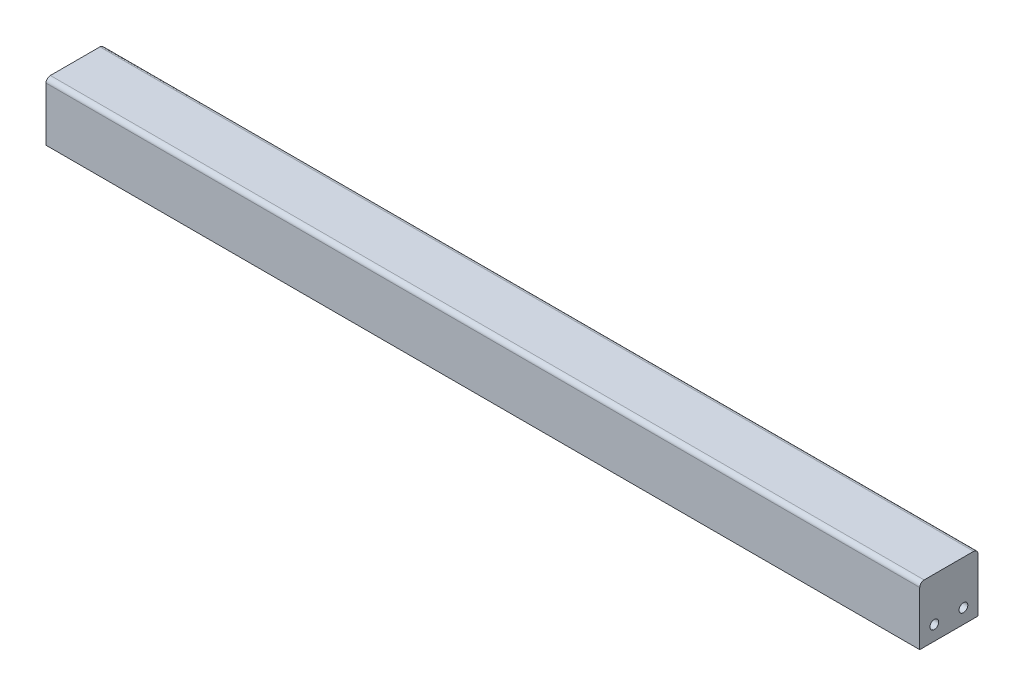
ISO-10303-21;
HEADER;
FILE_DESCRIPTION(('STEP AP214'),'2;1');
FILE_NAME('part.step','',(''),(''),'','','');
FILE_SCHEMA(('AUTOMOTIVE_DESIGN { 1 0 10303 214 1 1 1 1 }'));
ENDSEC;
DATA;
#1=APPLICATION_CONTEXT('core data for automotive mechanical design processes');
#2=APPLICATION_PROTOCOL_DEFINITION('international standard','automotive_design',2000,#1);
#3=PRODUCT_CONTEXT('',#1,'mechanical');
#4=PRODUCT('Part','Part','',(#3));
#5=PRODUCT_RELATED_PRODUCT_CATEGORY('part','',(#4));
#6=PRODUCT_DEFINITION_FORMATION('','',#4);
#7=PRODUCT_DEFINITION_CONTEXT('part definition',#1,'design');
#8=PRODUCT_DEFINITION('design','',#6,#7);
#9=PRODUCT_DEFINITION_SHAPE('','',#8);
#10=(LENGTH_UNIT() NAMED_UNIT(*) SI_UNIT(.MILLI.,.METRE.));
#11=(NAMED_UNIT(*) PLANE_ANGLE_UNIT() SI_UNIT($,.RADIAN.));
#12=(NAMED_UNIT(*) SI_UNIT($,.STERADIAN.) SOLID_ANGLE_UNIT());
#13=UNCERTAINTY_MEASURE_WITH_UNIT(LENGTH_MEASURE(1.E-05),#10,'distance_accuracy_value','');
#14=(GEOMETRIC_REPRESENTATION_CONTEXT(3) GLOBAL_UNCERTAINTY_ASSIGNED_CONTEXT((#13)) GLOBAL_UNIT_ASSIGNED_CONTEXT((#10,
#11,#12)) REPRESENTATION_CONTEXT('',''));
#15=CARTESIAN_POINT('',(0.,0.,0.));
#16=DIRECTION('',(0.,0.,1.));
#17=DIRECTION('',(1.,0.,0.));
#18=AXIS2_PLACEMENT_3D('',#15,#16,#17);
#19=CARTESIAN_POINT('',(300.,-20.,-20.));
#20=DIRECTION('',(0.,0.,1.));
#21=DIRECTION('',(1.,0.,0.));
#22=AXIS2_PLACEMENT_3D('',#19,#20,#21);
#23=PLANE('',#22);
#24=DIRECTION('',(0.,1.,0.));
#25=VECTOR('',#24,1.);
#26=CARTESIAN_POINT('',(-300.,-20.,-20.));
#27=LINE('',#26,#25);
#28=CARTESIAN_POINT('',(-300.,-20.,-20.));
#29=VERTEX_POINT('',#28);
#30=CARTESIAN_POINT('',(-300.,17.,-20.));
#31=VERTEX_POINT('',#30);
#32=EDGE_CURVE('E117',#29,#31,#27,.T.);
#33=ORIENTED_EDGE('',*,*,#32,.T.);
#34=DIRECTION('',(-1.,0.,0.));
#35=VECTOR('',#34,1.);
#36=CARTESIAN_POINT('',(300.,17.,-20.));
#37=LINE('',#36,#35);
#38=CARTESIAN_POINT('',(300.,17.,-20.));
#39=VERTEX_POINT('',#38);
#40=EDGE_CURVE('E11',#39,#31,#37,.T.);
#41=ORIENTED_EDGE('',*,*,#40,.F.);
#42=DIRECTION('',(0.,1.,0.));
#43=VECTOR('',#42,1.);
#44=CARTESIAN_POINT('',(300.,-20.,-20.));
#45=LINE('',#44,#43);
#46=CARTESIAN_POINT('',(300.,-20.,-20.));
#47=VERTEX_POINT('',#46);
#48=EDGE_CURVE('E128',#47,#39,#45,.T.);
#49=ORIENTED_EDGE('',*,*,#48,.F.);
#50=DIRECTION('',(-1.,0.,0.));
#51=VECTOR('',#50,1.);
#52=CARTESIAN_POINT('',(300.,-20.,-20.));
#53=LINE('',#52,#51);
#54=EDGE_CURVE('E113',#47,#29,#53,.T.);
#55=ORIENTED_EDGE('',*,*,#54,.T.);
#56=EDGE_LOOP('',(#33,#41,#49,#55));
#57=FACE_BOUND('',#56,.T.);
#58=ADVANCED_FACE('F33',(#57),#23,.F.);
#59=CARTESIAN_POINT('',(300.,17.,-17.));
#60=DIRECTION('',(-1.,0.,0.));
#61=DIRECTION('',(0.,0.,1.));
#62=AXIS2_PLACEMENT_3D('',#59,#60,#61);
#63=CYLINDRICAL_SURFACE('',#62,3.);
#64=CARTESIAN_POINT('',(-300.,17.,-17.));
#65=DIRECTION('',(1.,0.,0.));
#66=DIRECTION('',(0.,0.,-1.));
#67=AXIS2_PLACEMENT_3D('',#64,#65,#66);
#68=CIRCLE('',#67,3.);
#69=CARTESIAN_POINT('',(-300.,20.,-17.));
#70=VERTEX_POINT('',#69);
#71=EDGE_CURVE('E120',#31,#70,#68,.T.);
#72=ORIENTED_EDGE('',*,*,#71,.T.);
#73=DIRECTION('',(-1.,0.,0.));
#74=VECTOR('',#73,1.);
#75=CARTESIAN_POINT('',(300.,20.,-17.));
#76=LINE('',#75,#74);
#77=CARTESIAN_POINT('',(300.,20.,-17.));
#78=VERTEX_POINT('',#77);
#79=EDGE_CURVE('E41',#78,#70,#76,.T.);
#80=ORIENTED_EDGE('',*,*,#79,.F.);
#81=CARTESIAN_POINT('',(300.,17.,-17.));
#82=DIRECTION('',(1.,0.,0.));
#83=DIRECTION('',(0.,0.,-1.));
#84=AXIS2_PLACEMENT_3D('',#81,#82,#83);
#85=CIRCLE('',#84,3.);
#86=EDGE_CURVE('E86',#39,#78,#85,.T.);
#87=ORIENTED_EDGE('',*,*,#86,.F.);
#88=ORIENTED_EDGE('',*,*,#40,.T.);
#89=EDGE_LOOP('',(#72,#80,#87,#88));
#90=FACE_BOUND('',#89,.T.);
#91=ADVANCED_FACE('F153',(#90),#63,.T.);
#92=CARTESIAN_POINT('',(300.,20.,-17.));
#93=DIRECTION('',(0.,-1.,0.));
#94=DIRECTION('',(0.,0.,-1.));
#95=AXIS2_PLACEMENT_3D('',#92,#93,#94);
#96=PLANE('',#95);
#97=DIRECTION('',(0.,0.,1.));
#98=VECTOR('',#97,1.);
#99=CARTESIAN_POINT('',(-300.,20.,-17.));
#100=LINE('',#99,#98);
#101=CARTESIAN_POINT('',(-300.,20.,17.));
#102=VERTEX_POINT('',#101);
#103=EDGE_CURVE('E123',#70,#102,#100,.T.);
#104=ORIENTED_EDGE('',*,*,#103,.T.);
#105=DIRECTION('',(-1.,0.,0.));
#106=VECTOR('',#105,1.);
#107=CARTESIAN_POINT('',(300.,20.,17.));
#108=LINE('',#107,#106);
#109=CARTESIAN_POINT('',(300.,20.,17.));
#110=VERTEX_POINT('',#109);
#111=EDGE_CURVE('E108',#110,#102,#108,.T.);
#112=ORIENTED_EDGE('',*,*,#111,.F.);
#113=DIRECTION('',(0.,0.,1.));
#114=VECTOR('',#113,1.);
#115=CARTESIAN_POINT('',(300.,20.,-17.));
#116=LINE('',#115,#114);
#117=EDGE_CURVE('E99',#78,#110,#116,.T.);
#118=ORIENTED_EDGE('',*,*,#117,.F.);
#119=ORIENTED_EDGE('',*,*,#79,.T.);
#120=EDGE_LOOP('',(#104,#112,#118,#119));
#121=FACE_BOUND('',#120,.T.);
#122=ADVANCED_FACE('F134',(#121),#96,.F.);
#123=CARTESIAN_POINT('',(300.,17.,17.));
#124=DIRECTION('',(-1.,0.,0.));
#125=DIRECTION('',(0.,0.,1.));
#126=AXIS2_PLACEMENT_3D('',#123,#124,#125);
#127=CYLINDRICAL_SURFACE('',#126,3.);
#128=CARTESIAN_POINT('',(-300.,17.,17.));
#129=DIRECTION('',(1.,0.,0.));
#130=DIRECTION('',(0.,0.,-1.));
#131=AXIS2_PLACEMENT_3D('',#128,#129,#130);
#132=CIRCLE('',#131,3.);
#133=CARTESIAN_POINT('',(-300.,17.,20.));
#134=VERTEX_POINT('',#133);
#135=EDGE_CURVE('E107',#102,#134,#132,.T.);
#136=ORIENTED_EDGE('',*,*,#135,.T.);
#137=DIRECTION('',(-1.,0.,0.));
#138=VECTOR('',#137,1.);
#139=CARTESIAN_POINT('',(300.,17.,20.));
#140=LINE('',#139,#138);
#141=CARTESIAN_POINT('',(300.,17.,20.));
#142=VERTEX_POINT('',#141);
#143=EDGE_CURVE('E104',#142,#134,#140,.T.);
#144=ORIENTED_EDGE('',*,*,#143,.F.);
#145=CARTESIAN_POINT('',(300.,17.,17.));
#146=DIRECTION('',(1.,0.,0.));
#147=DIRECTION('',(0.,0.,-1.));
#148=AXIS2_PLACEMENT_3D('',#145,#146,#147);
#149=CIRCLE('',#148,3.);
#150=EDGE_CURVE('E93',#110,#142,#149,.T.);
#151=ORIENTED_EDGE('',*,*,#150,.F.);
#152=ORIENTED_EDGE('',*,*,#111,.T.);
#153=EDGE_LOOP('',(#136,#144,#151,#152));
#154=FACE_BOUND('',#153,.T.);
#155=ADVANCED_FACE('F105',(#154),#127,.T.);
#156=CARTESIAN_POINT('',(300.,-20.,20.));
#157=DIRECTION('',(0.,0.,-1.));
#158=DIRECTION('',(-1.,0.,0.));
#159=AXIS2_PLACEMENT_3D('',#156,#157,#158);
#160=PLANE('',#159);
#161=DIRECTION('',(0.,-1.,0.));
#162=VECTOR('',#161,1.);
#163=CARTESIAN_POINT('',(-300.,-20.,20.));
#164=LINE('',#163,#162);
#165=CARTESIAN_POINT('',(-300.,-20.,20.));
#166=VERTEX_POINT('',#165);
#167=EDGE_CURVE('E72',#134,#166,#164,.T.);
#168=ORIENTED_EDGE('',*,*,#167,.T.);
#169=DIRECTION('',(-1.,0.,0.));
#170=VECTOR('',#169,1.);
#171=CARTESIAN_POINT('',(300.,-20.,20.));
#172=LINE('',#171,#170);
#173=CARTESIAN_POINT('',(300.,-20.,20.));
#174=VERTEX_POINT('',#173);
#175=EDGE_CURVE('E109',#174,#166,#172,.T.);
#176=ORIENTED_EDGE('',*,*,#175,.F.);
#177=DIRECTION('',(0.,-1.,0.));
#178=VECTOR('',#177,1.);
#179=CARTESIAN_POINT('',(300.,-20.,20.));
#180=LINE('',#179,#178);
#181=EDGE_CURVE('E97',#142,#174,#180,.T.);
#182=ORIENTED_EDGE('',*,*,#181,.F.);
#183=ORIENTED_EDGE('',*,*,#143,.T.);
#184=EDGE_LOOP('',(#168,#176,#182,#183));
#185=FACE_BOUND('',#184,.T.);
#186=ADVANCED_FACE('F111',(#185),#160,.F.);
#187=CARTESIAN_POINT('',(300.,-20.,-20.));
#188=DIRECTION('',(0.,1.,0.));
#189=DIRECTION('',(0.,0.,1.));
#190=AXIS2_PLACEMENT_3D('',#187,#188,#189);
#191=PLANE('',#190);
#192=DIRECTION('',(0.,0.,-1.));
#193=VECTOR('',#192,1.);
#194=CARTESIAN_POINT('',(-300.,-20.,-20.));
#195=LINE('',#194,#193);
#196=EDGE_CURVE('E78',#166,#29,#195,.T.);
#197=ORIENTED_EDGE('',*,*,#196,.T.);
#198=ORIENTED_EDGE('',*,*,#54,.F.);
#199=DIRECTION('',(0.,0.,-1.));
#200=VECTOR('',#199,1.);
#201=CARTESIAN_POINT('',(300.,-20.,-20.));
#202=LINE('',#201,#200);
#203=EDGE_CURVE('E49',#174,#47,#202,.T.);
#204=ORIENTED_EDGE('',*,*,#203,.F.);
#205=ORIENTED_EDGE('',*,*,#175,.T.);
#206=EDGE_LOOP('',(#197,#198,#204,#205));
#207=FACE_BOUND('',#206,.T.);
#208=ADVANCED_FACE('F141',(#207),#191,.F.);
#209=CARTESIAN_POINT('',(300.,17.,-17.));
#210=DIRECTION('',(1.,0.,0.));
#211=DIRECTION('',(0.,0.,-1.));
#212=AXIS2_PLACEMENT_3D('',#209,#210,#211);
#213=PLANE('',#212);
#214=CARTESIAN_POINT('',(300.,-10.,10.));
#215=DIRECTION('',(-1.,0.,0.));
#216=DIRECTION('',(0.,0.,1.));
#217=AXIS2_PLACEMENT_3D('',#214,#215,#216);
#218=CIRCLE('',#217,3.);
#219=CARTESIAN_POINT('',(300.,-10.,13.));
#220=VERTEX_POINT('',#219);
#221=EDGE_CURVE('E277',#220,#220,#218,.T.);
#222=ORIENTED_EDGE('',*,*,#221,.T.);
#223=EDGE_LOOP('',(#222));
#224=FACE_BOUND('',#223,.T.);
#225=CARTESIAN_POINT('',(300.,-10.,-10.));
#226=DIRECTION('',(-1.,0.,0.));
#227=DIRECTION('',(0.,0.,1.));
#228=AXIS2_PLACEMENT_3D('',#225,#226,#227);
#229=CIRCLE('',#228,3.);
#230=CARTESIAN_POINT('',(300.,-10.,-7.));
#231=VERTEX_POINT('',#230);
#232=EDGE_CURVE('E276',#231,#231,#229,.T.);
#233=ORIENTED_EDGE('',*,*,#232,.T.);
#234=EDGE_LOOP('',(#233));
#235=FACE_BOUND('',#234,.T.);
#236=ORIENTED_EDGE('',*,*,#48,.T.);
#237=ORIENTED_EDGE('',*,*,#86,.T.);
#238=ORIENTED_EDGE('',*,*,#117,.T.);
#239=ORIENTED_EDGE('',*,*,#150,.T.);
#240=ORIENTED_EDGE('',*,*,#181,.T.);
#241=ORIENTED_EDGE('',*,*,#203,.T.);
#242=EDGE_LOOP('',(#236,#237,#238,#239,#240,#241));
#243=FACE_BOUND('',#242,.T.);
#244=ADVANCED_FACE('F95',(#224,#235,#243),#213,.T.);
#245=CARTESIAN_POINT('',(-300.,17.,-17.));
#246=DIRECTION('',(1.,0.,0.));
#247=DIRECTION('',(0.,0.,-1.));
#248=AXIS2_PLACEMENT_3D('',#245,#246,#247);
#249=PLANE('',#248);
#250=CARTESIAN_POINT('',(-300.,-10.,10.));
#251=DIRECTION('',(-1.,0.,0.));
#252=DIRECTION('',(0.,0.,1.));
#253=AXIS2_PLACEMENT_3D('',#250,#251,#252);
#254=CIRCLE('',#253,3.);
#255=CARTESIAN_POINT('',(-300.,-10.,13.));
#256=VERTEX_POINT('',#255);
#257=EDGE_CURVE('E286',#256,#256,#254,.T.);
#258=ORIENTED_EDGE('',*,*,#257,.F.);
#259=EDGE_LOOP('',(#258));
#260=FACE_BOUND('',#259,.T.);
#261=CARTESIAN_POINT('',(-300.,-10.,-10.));
#262=DIRECTION('',(-1.,0.,0.));
#263=DIRECTION('',(0.,0.,1.));
#264=AXIS2_PLACEMENT_3D('',#261,#262,#263);
#265=CIRCLE('',#264,3.);
#266=CARTESIAN_POINT('',(-300.,-10.,-7.));
#267=VERTEX_POINT('',#266);
#268=EDGE_CURVE('E291',#267,#267,#265,.T.);
#269=ORIENTED_EDGE('',*,*,#268,.F.);
#270=EDGE_LOOP('',(#269));
#271=FACE_BOUND('',#270,.T.);
#272=ORIENTED_EDGE('',*,*,#32,.F.);
#273=ORIENTED_EDGE('',*,*,#196,.F.);
#274=ORIENTED_EDGE('',*,*,#167,.F.);
#275=ORIENTED_EDGE('',*,*,#135,.F.);
#276=ORIENTED_EDGE('',*,*,#103,.F.);
#277=ORIENTED_EDGE('',*,*,#71,.F.);
#278=EDGE_LOOP('',(#272,#273,#274,#275,#276,#277));
#279=FACE_BOUND('',#278,.T.);
#280=ADVANCED_FACE('F137',(#260,#271,#279),#249,.F.);
#281=CARTESIAN_POINT('',(-290.,-10.,-10.));
#282=DIRECTION('',(-1.,0.,0.));
#283=DIRECTION('',(0.,0.,1.));
#284=AXIS2_PLACEMENT_3D('',#281,#282,#283);
#285=CYLINDRICAL_SURFACE('',#284,3.);
#286=CARTESIAN_POINT('',(-290.,-10.,-10.));
#287=DIRECTION('',(-1.,0.,0.));
#288=DIRECTION('',(0.,0.,1.));
#289=AXIS2_PLACEMENT_3D('',#286,#287,#288);
#290=CIRCLE('',#289,3.);
#291=CARTESIAN_POINT('',(-290.,-10.,-7.));
#292=VERTEX_POINT('',#291);
#293=EDGE_CURVE('E121',#292,#292,#290,.T.);
#294=ORIENTED_EDGE('',*,*,#293,.F.);
#295=EDGE_LOOP('',(#294));
#296=FACE_BOUND('',#295,.T.);
#297=ORIENTED_EDGE('',*,*,#268,.T.);
#298=EDGE_LOOP('',(#297));
#299=FACE_BOUND('',#298,.T.);
#300=ADVANCED_FACE('F185',(#296,#299),#285,.F.);
#301=CARTESIAN_POINT('',(-290.,-10.,-10.));
#302=DIRECTION('',(-1.,0.,0.));
#303=DIRECTION('',(0.,0.,1.));
#304=AXIS2_PLACEMENT_3D('',#301,#302,#303);
#305=PLANE('',#304);
#306=ORIENTED_EDGE('',*,*,#293,.T.);
#307=EDGE_LOOP('',(#306));
#308=FACE_BOUND('',#307,.T.);
#309=ADVANCED_FACE('F194',(#308),#305,.T.);
#310=CARTESIAN_POINT('',(-290.,-10.,10.));
#311=DIRECTION('',(-1.,0.,0.));
#312=DIRECTION('',(0.,0.,1.));
#313=AXIS2_PLACEMENT_3D('',#310,#311,#312);
#314=CYLINDRICAL_SURFACE('',#313,3.);
#315=CARTESIAN_POINT('',(-290.,-10.,10.));
#316=DIRECTION('',(-1.,0.,0.));
#317=DIRECTION('',(0.,0.,1.));
#318=AXIS2_PLACEMENT_3D('',#315,#316,#317);
#319=CIRCLE('',#318,3.);
#320=CARTESIAN_POINT('',(-290.,-10.,13.));
#321=VERTEX_POINT('',#320);
#322=EDGE_CURVE('E288',#321,#321,#319,.T.);
#323=ORIENTED_EDGE('',*,*,#322,.F.);
#324=EDGE_LOOP('',(#323));
#325=FACE_BOUND('',#324,.T.);
#326=ORIENTED_EDGE('',*,*,#257,.T.);
#327=EDGE_LOOP('',(#326));
#328=FACE_BOUND('',#327,.T.);
#329=ADVANCED_FACE('F204',(#325,#328),#314,.F.);
#330=CARTESIAN_POINT('',(-290.,-10.,10.));
#331=DIRECTION('',(-1.,0.,0.));
#332=DIRECTION('',(0.,0.,1.));
#333=AXIS2_PLACEMENT_3D('',#330,#331,#332);
#334=PLANE('',#333);
#335=ORIENTED_EDGE('',*,*,#322,.T.);
#336=EDGE_LOOP('',(#335));
#337=FACE_BOUND('',#336,.T.);
#338=ADVANCED_FACE('F214',(#337),#334,.T.);
#339=CARTESIAN_POINT('',(290.,-10.,-10.));
#340=DIRECTION('',(1.,0.,0.));
#341=DIRECTION('',(0.,0.,-1.));
#342=AXIS2_PLACEMENT_3D('',#339,#340,#341);
#343=CYLINDRICAL_SURFACE('',#342,3.);
#344=CARTESIAN_POINT('',(290.,-10.,-10.));
#345=DIRECTION('',(-1.,0.,0.));
#346=DIRECTION('',(0.,0.,1.));
#347=AXIS2_PLACEMENT_3D('',#344,#345,#346);
#348=CIRCLE('',#347,3.);
#349=CARTESIAN_POINT('',(290.,-10.,-7.));
#350=VERTEX_POINT('',#349);
#351=EDGE_CURVE('E280',#350,#350,#348,.T.);
#352=ORIENTED_EDGE('',*,*,#351,.T.);
#353=EDGE_LOOP('',(#352));
#354=FACE_BOUND('',#353,.T.);
#355=ORIENTED_EDGE('',*,*,#232,.F.);
#356=EDGE_LOOP('',(#355));
#357=FACE_BOUND('',#356,.T.);
#358=ADVANCED_FACE('F224',(#354,#357),#343,.F.);
#359=CARTESIAN_POINT('',(290.,-10.,-10.));
#360=DIRECTION('',(1.,0.,0.));
#361=DIRECTION('',(0.,0.,1.));
#362=AXIS2_PLACEMENT_3D('',#359,#360,#361);
#363=PLANE('',#362);
#364=ORIENTED_EDGE('',*,*,#351,.F.);
#365=EDGE_LOOP('',(#364));
#366=FACE_BOUND('',#365,.T.);
#367=ADVANCED_FACE('F239',(#366),#363,.T.);
#368=CARTESIAN_POINT('',(290.,-10.,10.));
#369=DIRECTION('',(1.,0.,0.));
#370=DIRECTION('',(0.,0.,-1.));
#371=AXIS2_PLACEMENT_3D('',#368,#369,#370);
#372=CYLINDRICAL_SURFACE('',#371,3.);
#373=CARTESIAN_POINT('',(290.,-10.,10.));
#374=DIRECTION('',(-1.,0.,0.));
#375=DIRECTION('',(0.,0.,1.));
#376=AXIS2_PLACEMENT_3D('',#373,#374,#375);
#377=CIRCLE('',#376,3.);
#378=CARTESIAN_POINT('',(290.,-10.,13.));
#379=VERTEX_POINT('',#378);
#380=EDGE_CURVE('E275',#379,#379,#377,.T.);
#381=ORIENTED_EDGE('',*,*,#380,.T.);
#382=EDGE_LOOP('',(#381));
#383=FACE_BOUND('',#382,.T.);
#384=ORIENTED_EDGE('',*,*,#221,.F.);
#385=EDGE_LOOP('',(#384));
#386=FACE_BOUND('',#385,.T.);
#387=ADVANCED_FACE('F249',(#383,#386),#372,.F.);
#388=CARTESIAN_POINT('',(290.,-10.,10.));
#389=DIRECTION('',(1.,0.,0.));
#390=DIRECTION('',(0.,0.,1.));
#391=AXIS2_PLACEMENT_3D('',#388,#389,#390);
#392=PLANE('',#391);
#393=ORIENTED_EDGE('',*,*,#380,.F.);
#394=EDGE_LOOP('',(#393));
#395=FACE_BOUND('',#394,.T.);
#396=ADVANCED_FACE('F259',(#395),#392,.T.);
#397=CLOSED_SHELL('',(#58,#91,#122,#155,#186,#208,#244,#280,#300,#309,#329,#338,#358,#367,#387,#396));
#398=MANIFOLD_SOLID_BREP('B2',#397);
#399=ADVANCED_BREP_SHAPE_REPRESENTATION('',(#18,#398),#14);
#400=SHAPE_DEFINITION_REPRESENTATION(#9,#399);
ENDSEC;
END-ISO-10303-21;
